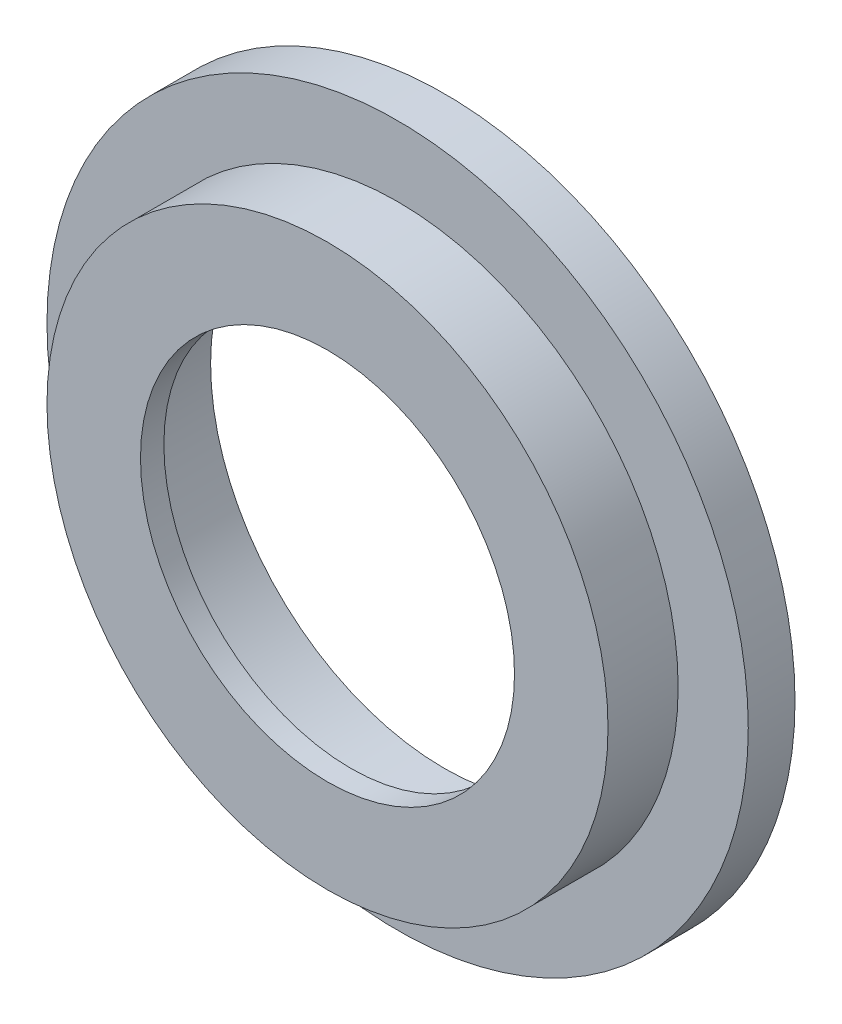
ISO-10303-21;
HEADER;
FILE_DESCRIPTION(('STEP AP214'),'2;1');
FILE_NAME('part.step','',(''),(''),'','','');
FILE_SCHEMA(('AUTOMOTIVE_DESIGN { 1 0 10303 214 1 1 1 1 }'));
ENDSEC;
DATA;
#1=APPLICATION_CONTEXT('core data for automotive mechanical design processes');
#2=APPLICATION_PROTOCOL_DEFINITION('international standard','automotive_design',2000,#1);
#3=PRODUCT_CONTEXT('',#1,'mechanical');
#4=PRODUCT('Part','Part','',(#3));
#5=PRODUCT_RELATED_PRODUCT_CATEGORY('part','',(#4));
#6=PRODUCT_DEFINITION_FORMATION('','',#4);
#7=PRODUCT_DEFINITION_CONTEXT('part definition',#1,'design');
#8=PRODUCT_DEFINITION('design','',#6,#7);
#9=PRODUCT_DEFINITION_SHAPE('','',#8);
#10=(LENGTH_UNIT() NAMED_UNIT(*) SI_UNIT(.MILLI.,.METRE.));
#11=(NAMED_UNIT(*) PLANE_ANGLE_UNIT() SI_UNIT($,.RADIAN.));
#12=(NAMED_UNIT(*) SI_UNIT($,.STERADIAN.) SOLID_ANGLE_UNIT());
#13=UNCERTAINTY_MEASURE_WITH_UNIT(LENGTH_MEASURE(1.E-05),#10,'distance_accuracy_value','');
#14=(GEOMETRIC_REPRESENTATION_CONTEXT(3) GLOBAL_UNCERTAINTY_ASSIGNED_CONTEXT((#13)) GLOBAL_UNIT_ASSIGNED_CONTEXT((#10,
#11,#12)) REPRESENTATION_CONTEXT('',''));
#15=CARTESIAN_POINT('',(0.,0.,0.));
#16=DIRECTION('',(0.,0.,1.));
#17=DIRECTION('',(1.,0.,0.));
#18=AXIS2_PLACEMENT_3D('',#15,#16,#17);
#19=CARTESIAN_POINT('',(0.,0.,5.));
#20=DIRECTION('',(0.,0.,-1.));
#21=DIRECTION('',(-1.,0.,0.));
#22=AXIS2_PLACEMENT_3D('',#19,#20,#21);
#23=CYLINDRICAL_SURFACE('',#22,8.);
#24=CARTESIAN_POINT('',(0.,0.,5.));
#25=DIRECTION('',(0.,0.,-1.));
#26=DIRECTION('',(-1.,0.,0.));
#27=AXIS2_PLACEMENT_3D('',#24,#25,#26);
#28=CIRCLE('',#27,8.);
#29=CARTESIAN_POINT('',(-8.,0.,5.));
#30=VERTEX_POINT('',#29);
#31=EDGE_CURVE('E10',#30,#30,#28,.F.);
#32=ORIENTED_EDGE('',*,*,#31,.T.);
#33=EDGE_LOOP('',(#32));
#34=FACE_BOUND('',#33,.T.);
#35=CARTESIAN_POINT('',(0.,0.,4.));
#36=DIRECTION('',(0.,0.,-1.));
#37=DIRECTION('',(-1.,0.,0.));
#38=AXIS2_PLACEMENT_3D('',#35,#36,#37);
#39=CIRCLE('',#38,8.);
#40=CARTESIAN_POINT('',(-8.,0.,4.));
#41=VERTEX_POINT('',#40);
#42=EDGE_CURVE('E21',#41,#41,#39,.F.);
#43=ORIENTED_EDGE('',*,*,#42,.F.);
#44=EDGE_LOOP('',(#43));
#45=FACE_BOUND('',#44,.T.);
#46=ADVANCED_FACE('F15',(#34,#45),#23,.F.);
#47=CARTESIAN_POINT('',(0.,0.,5.));
#48=DIRECTION('',(0.,0.,-1.));
#49=DIRECTION('',(-1.,0.,0.));
#50=AXIS2_PLACEMENT_3D('',#47,#48,#49);
#51=CYLINDRICAL_SURFACE('',#50,12.);
#52=CARTESIAN_POINT('',(0.,0.,2.));
#53=DIRECTION('',(0.,0.,1.));
#54=DIRECTION('',(1.,0.,0.));
#55=AXIS2_PLACEMENT_3D('',#52,#53,#54);
#56=CIRCLE('',#55,12.);
#57=CARTESIAN_POINT('',(12.,0.,2.));
#58=VERTEX_POINT('',#57);
#59=EDGE_CURVE('E25',#58,#58,#56,.T.);
#60=ORIENTED_EDGE('',*,*,#59,.T.);
#61=EDGE_LOOP('',(#60));
#62=FACE_BOUND('',#61,.T.);
#63=CARTESIAN_POINT('',(0.,0.,5.));
#64=DIRECTION('',(0.,0.,1.));
#65=DIRECTION('',(1.,0.,0.));
#66=AXIS2_PLACEMENT_3D('',#63,#64,#65);
#67=CIRCLE('',#66,12.);
#68=CARTESIAN_POINT('',(12.,0.,5.));
#69=VERTEX_POINT('',#68);
#70=EDGE_CURVE('E29',#69,#69,#67,.T.);
#71=ORIENTED_EDGE('',*,*,#70,.F.);
#72=EDGE_LOOP('',(#71));
#73=FACE_BOUND('',#72,.T.);
#74=ADVANCED_FACE('F75',(#62,#73),#51,.T.);
#75=CARTESIAN_POINT('',(0.,0.,5.));
#76=DIRECTION('',(0.,0.,1.));
#77=DIRECTION('',(1.,0.,0.));
#78=AXIS2_PLACEMENT_3D('',#75,#76,#77);
#79=PLANE('',#78);
#80=ORIENTED_EDGE('',*,*,#70,.T.);
#81=EDGE_LOOP('',(#80));
#82=FACE_BOUND('',#81,.T.);
#83=ORIENTED_EDGE('',*,*,#31,.F.);
#84=EDGE_LOOP('',(#83));
#85=FACE_BOUND('',#84,.T.);
#86=ADVANCED_FACE('F60',(#82,#85),#79,.T.);
#87=CARTESIAN_POINT('',(0.,0.,0.));
#88=DIRECTION('',(0.,0.,1.));
#89=DIRECTION('',(1.,0.,0.));
#90=AXIS2_PLACEMENT_3D('',#87,#88,#89);
#91=PLANE('',#90);
#92=CARTESIAN_POINT('',(0.,0.,0.));
#93=DIRECTION('',(0.,0.,-1.));
#94=DIRECTION('',(-1.,0.,0.));
#95=AXIS2_PLACEMENT_3D('',#92,#93,#94);
#96=CIRCLE('',#95,10.);
#97=CARTESIAN_POINT('',(-10.,0.,0.));
#98=VERTEX_POINT('',#97);
#99=EDGE_CURVE('E34',#98,#98,#96,.T.);
#100=ORIENTED_EDGE('',*,*,#99,.F.);
#101=EDGE_LOOP('',(#100));
#102=FACE_BOUND('',#101,.T.);
#103=CARTESIAN_POINT('',(0.,0.,0.));
#104=DIRECTION('',(0.,0.,1.));
#105=DIRECTION('',(1.,0.,0.));
#106=AXIS2_PLACEMENT_3D('',#103,#104,#105);
#107=CIRCLE('',#106,15.);
#108=CARTESIAN_POINT('',(15.,0.,0.));
#109=VERTEX_POINT('',#108);
#110=EDGE_CURVE('E37',#109,#109,#107,.T.);
#111=ORIENTED_EDGE('',*,*,#110,.F.);
#112=EDGE_LOOP('',(#111));
#113=FACE_BOUND('',#112,.T.);
#114=ADVANCED_FACE('F56',(#102,#113),#91,.F.);
#115=CARTESIAN_POINT('',(0.,0.,2.));
#116=DIRECTION('',(0.,0.,-1.));
#117=DIRECTION('',(-1.,0.,0.));
#118=AXIS2_PLACEMENT_3D('',#115,#116,#117);
#119=CYLINDRICAL_SURFACE('',#118,15.);
#120=CARTESIAN_POINT('',(0.,0.,2.));
#121=DIRECTION('',(0.,0.,1.));
#122=DIRECTION('',(1.,0.,0.));
#123=AXIS2_PLACEMENT_3D('',#120,#121,#122);
#124=CIRCLE('',#123,15.);
#125=CARTESIAN_POINT('',(15.,0.,2.));
#126=VERTEX_POINT('',#125);
#127=EDGE_CURVE('E40',#126,#126,#124,.T.);
#128=ORIENTED_EDGE('',*,*,#127,.F.);
#129=EDGE_LOOP('',(#128));
#130=FACE_BOUND('',#129,.T.);
#131=ORIENTED_EDGE('',*,*,#110,.T.);
#132=EDGE_LOOP('',(#131));
#133=FACE_BOUND('',#132,.T.);
#134=ADVANCED_FACE('F59',(#130,#133),#119,.T.);
#135=CARTESIAN_POINT('',(0.,0.,2.));
#136=DIRECTION('',(0.,0.,1.));
#137=DIRECTION('',(1.,0.,0.));
#138=AXIS2_PLACEMENT_3D('',#135,#136,#137);
#139=PLANE('',#138);
#140=ORIENTED_EDGE('',*,*,#59,.F.);
#141=EDGE_LOOP('',(#140));
#142=FACE_BOUND('',#141,.T.);
#143=ORIENTED_EDGE('',*,*,#127,.T.);
#144=EDGE_LOOP('',(#143));
#145=FACE_BOUND('',#144,.T.);
#146=ADVANCED_FACE('F52',(#142,#145),#139,.T.);
#147=CARTESIAN_POINT('',(0.,0.,4.));
#148=DIRECTION('',(0.,0.,-1.));
#149=DIRECTION('',(-1.,0.,0.));
#150=AXIS2_PLACEMENT_3D('',#147,#148,#149);
#151=CYLINDRICAL_SURFACE('',#150,10.);
#152=CARTESIAN_POINT('',(0.,0.,4.));
#153=DIRECTION('',(0.,0.,-1.));
#154=DIRECTION('',(-1.,0.,0.));
#155=AXIS2_PLACEMENT_3D('',#152,#153,#154);
#156=CIRCLE('',#155,10.);
#157=CARTESIAN_POINT('',(-10.,0.,4.));
#158=VERTEX_POINT('',#157);
#159=EDGE_CURVE('E43',#158,#158,#156,.T.);
#160=ORIENTED_EDGE('',*,*,#159,.F.);
#161=EDGE_LOOP('',(#160));
#162=FACE_BOUND('',#161,.T.);
#163=ORIENTED_EDGE('',*,*,#99,.T.);
#164=EDGE_LOOP('',(#163));
#165=FACE_BOUND('',#164,.T.);
#166=ADVANCED_FACE('F49',(#162,#165),#151,.F.);
#167=CARTESIAN_POINT('',(0.,0.,4.));
#168=DIRECTION('',(0.,0.,-1.));
#169=DIRECTION('',(1.,0.,0.));
#170=AXIS2_PLACEMENT_3D('',#167,#168,#169);
#171=PLANE('',#170);
#172=ORIENTED_EDGE('',*,*,#42,.T.);
#173=EDGE_LOOP('',(#172));
#174=FACE_BOUND('',#173,.T.);
#175=ORIENTED_EDGE('',*,*,#159,.T.);
#176=EDGE_LOOP('',(#175));
#177=FACE_BOUND('',#176,.T.);
#178=ADVANCED_FACE('F47',(#174,#177),#171,.T.);
#179=CLOSED_SHELL('',(#46,#74,#86,#114,#134,#146,#166,#178));
#180=MANIFOLD_SOLID_BREP('B1',#179);
#181=ADVANCED_BREP_SHAPE_REPRESENTATION('',(#18,#180),#14);
#182=SHAPE_DEFINITION_REPRESENTATION(#9,#181);
ENDSEC;
END-ISO-10303-21;
